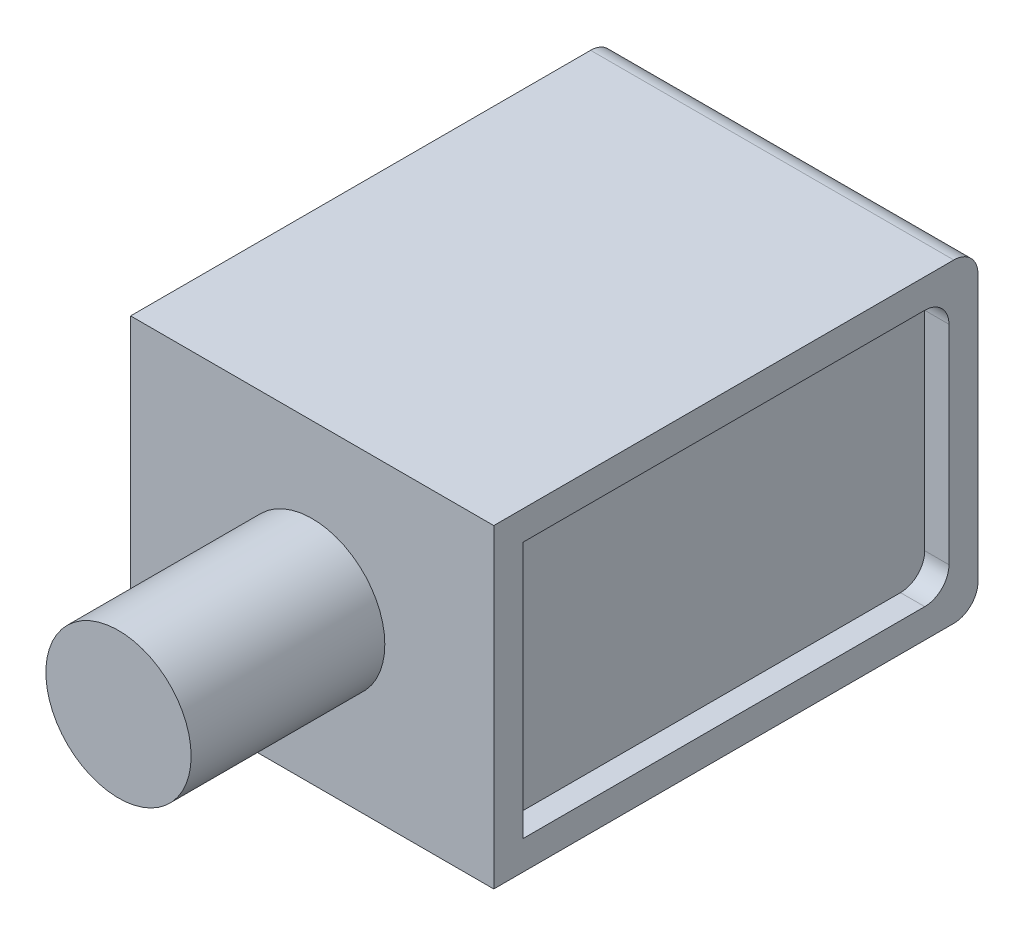
ISO-10303-21;
HEADER;
FILE_DESCRIPTION(('STEP AP214'),'2;1');
FILE_NAME('part.step','',(''),(''),'','','');
FILE_SCHEMA(('AUTOMOTIVE_DESIGN { 1 0 10303 214 1 1 1 1 }'));
ENDSEC;
DATA;
#1=APPLICATION_CONTEXT('core data for automotive mechanical design processes');
#2=APPLICATION_PROTOCOL_DEFINITION('international standard','automotive_design',2000,#1);
#3=PRODUCT_CONTEXT('',#1,'mechanical');
#4=PRODUCT('Part','Part','',(#3));
#5=PRODUCT_RELATED_PRODUCT_CATEGORY('part','',(#4));
#6=PRODUCT_DEFINITION_FORMATION('','',#4);
#7=PRODUCT_DEFINITION_CONTEXT('part definition',#1,'design');
#8=PRODUCT_DEFINITION('design','',#6,#7);
#9=PRODUCT_DEFINITION_SHAPE('','',#8);
#10=(LENGTH_UNIT() NAMED_UNIT(*) SI_UNIT(.MILLI.,.METRE.));
#11=(NAMED_UNIT(*) PLANE_ANGLE_UNIT() SI_UNIT($,.RADIAN.));
#12=(NAMED_UNIT(*) SI_UNIT($,.STERADIAN.) SOLID_ANGLE_UNIT());
#13=UNCERTAINTY_MEASURE_WITH_UNIT(LENGTH_MEASURE(1.E-05),#10,'distance_accuracy_value','');
#14=(GEOMETRIC_REPRESENTATION_CONTEXT(3) GLOBAL_UNCERTAINTY_ASSIGNED_CONTEXT((#13)) GLOBAL_UNIT_ASSIGNED_CONTEXT((#10,
#11,#12)) REPRESENTATION_CONTEXT('',''));
#15=CARTESIAN_POINT('',(0.,0.,0.));
#16=DIRECTION('',(0.,0.,1.));
#17=DIRECTION('',(1.,0.,0.));
#18=AXIS2_PLACEMENT_3D('',#15,#16,#17);
#19=CARTESIAN_POINT('',(-7.5,-6.5,10.));
#20=DIRECTION('',(1.,0.,0.));
#21=DIRECTION('',(0.,1.,0.));
#22=AXIS2_PLACEMENT_3D('',#19,#20,#21);
#23=PLANE('',#22);
#24=DIRECTION('',(0.,-1.,0.));
#25=VECTOR('',#24,1.);
#26=CARTESIAN_POINT('',(-7.5,-6.5,-10.));
#27=LINE('',#26,#25);
#28=CARTESIAN_POINT('',(-7.5,5.5,-10.));
#29=VERTEX_POINT('',#28);
#30=CARTESIAN_POINT('',(-7.5,-5.5,-10.));
#31=VERTEX_POINT('',#30);
#32=EDGE_CURVE('E230',#29,#31,#27,.T.);
#33=ORIENTED_EDGE('',*,*,#32,.T.);
#34=CARTESIAN_POINT('',(-7.5,-5.5,-9.));
#35=DIRECTION('',(1.,0.,0.));
#36=DIRECTION('',(0.,1.,0.));
#37=AXIS2_PLACEMENT_3D('',#34,#35,#36);
#38=CIRCLE('',#37,1.);
#39=CARTESIAN_POINT('',(-7.5,-6.5,-9.));
#40=VERTEX_POINT('',#39);
#41=EDGE_CURVE('E272',#31,#40,#38,.F.);
#42=ORIENTED_EDGE('',*,*,#41,.T.);
#43=DIRECTION('',(0.,0.,-1.));
#44=VECTOR('',#43,1.);
#45=CARTESIAN_POINT('',(-7.5,-6.5,10.));
#46=LINE('',#45,#44);
#47=CARTESIAN_POINT('',(-7.5,-6.5,10.));
#48=VERTEX_POINT('',#47);
#49=EDGE_CURVE('E256',#48,#40,#46,.T.);
#50=ORIENTED_EDGE('',*,*,#49,.F.);
#51=DIRECTION('',(0.,-1.,0.));
#52=VECTOR('',#51,1.);
#53=CARTESIAN_POINT('',(-7.5,-6.5,10.));
#54=LINE('',#53,#52);
#55=CARTESIAN_POINT('',(-7.5,6.5,10.));
#56=VERTEX_POINT('',#55);
#57=EDGE_CURVE('E233',#56,#48,#54,.T.);
#58=ORIENTED_EDGE('',*,*,#57,.F.);
#59=DIRECTION('',(0.,0.,-1.));
#60=VECTOR('',#59,1.);
#61=CARTESIAN_POINT('',(-7.5,6.5,10.));
#62=LINE('',#61,#60);
#63=CARTESIAN_POINT('',(-7.5,6.5,-9.));
#64=VERTEX_POINT('',#63);
#65=EDGE_CURVE('E243',#56,#64,#62,.T.);
#66=ORIENTED_EDGE('',*,*,#65,.T.);
#67=CARTESIAN_POINT('',(-7.5,5.5,-9.));
#68=DIRECTION('',(1.,0.,0.));
#69=DIRECTION('',(0.,1.,0.));
#70=AXIS2_PLACEMENT_3D('',#67,#68,#69);
#71=CIRCLE('',#70,1.);
#72=EDGE_CURVE('E270',#64,#29,#71,.F.);
#73=ORIENTED_EDGE('',*,*,#72,.T.);
#74=EDGE_LOOP('',(#33,#42,#50,#58,#66,#73));
#75=FACE_BOUND('',#74,.T.);
#76=DIRECTION('',(0.,0.,-1.));
#77=VECTOR('',#76,1.);
#78=CARTESIAN_POINT('',(-7.5,-5.3,8.8));
#79=LINE('',#78,#77);
#80=CARTESIAN_POINT('',(-7.5,-5.3,8.8));
#81=VERTEX_POINT('',#80);
#82=CARTESIAN_POINT('',(-7.5,-5.3,-7.8));
#83=VERTEX_POINT('',#82);
#84=EDGE_CURVE('E183',#81,#83,#79,.T.);
#85=ORIENTED_EDGE('',*,*,#84,.T.);
#86=CARTESIAN_POINT('',(-7.5,-4.3,-7.8));
#87=DIRECTION('',(1.,0.,0.));
#88=DIRECTION('',(0.,1.,0.));
#89=AXIS2_PLACEMENT_3D('',#86,#87,#88);
#90=CIRCLE('',#89,1.);
#91=CARTESIAN_POINT('',(-7.5,-4.3,-8.8));
#92=VERTEX_POINT('',#91);
#93=EDGE_CURVE('E305',#83,#92,#90,.T.);
#94=ORIENTED_EDGE('',*,*,#93,.T.);
#95=DIRECTION('',(0.,1.,0.));
#96=VECTOR('',#95,1.);
#97=CARTESIAN_POINT('',(-7.5,-5.3,-8.8));
#98=LINE('',#97,#96);
#99=CARTESIAN_POINT('',(-7.5,4.3,-8.8));
#100=VERTEX_POINT('',#99);
#101=EDGE_CURVE('E197',#92,#100,#98,.T.);
#102=ORIENTED_EDGE('',*,*,#101,.T.);
#103=CARTESIAN_POINT('',(-7.5,4.3,-7.8));
#104=DIRECTION('',(1.,0.,0.));
#105=DIRECTION('',(0.,1.,0.));
#106=AXIS2_PLACEMENT_3D('',#103,#104,#105);
#107=CIRCLE('',#106,1.);
#108=CARTESIAN_POINT('',(-7.5,5.3,-7.8));
#109=VERTEX_POINT('',#108);
#110=EDGE_CURVE('E43',#100,#109,#107,.T.);
#111=ORIENTED_EDGE('',*,*,#110,.T.);
#112=DIRECTION('',(0.,0.,1.));
#113=VECTOR('',#112,1.);
#114=CARTESIAN_POINT('',(-7.5,5.3,-8.8));
#115=LINE('',#114,#113);
#116=CARTESIAN_POINT('',(-7.5,5.3,8.8));
#117=VERTEX_POINT('',#116);
#118=EDGE_CURVE('E193',#109,#117,#115,.T.);
#119=ORIENTED_EDGE('',*,*,#118,.T.);
#120=DIRECTION('',(0.,-1.,0.));
#121=VECTOR('',#120,1.);
#122=CARTESIAN_POINT('',(-7.5,5.3,8.8));
#123=LINE('',#122,#121);
#124=EDGE_CURVE('E201',#117,#81,#123,.T.);
#125=ORIENTED_EDGE('',*,*,#124,.T.);
#126=EDGE_LOOP('',(#85,#94,#102,#111,#119,#125));
#127=FACE_BOUND('',#126,.T.);
#128=ADVANCED_FACE('F39',(#75,#127),#23,.F.);
#129=CARTESIAN_POINT('',(7.5,-6.5,10.));
#130=DIRECTION('',(0.,1.,0.));
#131=DIRECTION('',(-1.,0.,0.));
#132=AXIS2_PLACEMENT_3D('',#129,#130,#131);
#133=PLANE('',#132);
#134=ORIENTED_EDGE('',*,*,#49,.T.);
#135=DIRECTION('',(1.,0.,0.));
#136=VECTOR('',#135,1.);
#137=CARTESIAN_POINT('',(7.5,-6.5,-9.));
#138=LINE('',#137,#136);
#139=CARTESIAN_POINT('',(7.5,-6.5,-9.));
#140=VERTEX_POINT('',#139);
#141=EDGE_CURVE('E259',#40,#140,#138,.T.);
#142=ORIENTED_EDGE('',*,*,#141,.T.);
#143=DIRECTION('',(0.,0.,-1.));
#144=VECTOR('',#143,1.);
#145=CARTESIAN_POINT('',(7.5,-6.5,10.));
#146=LINE('',#145,#144);
#147=CARTESIAN_POINT('',(7.5,-6.5,10.));
#148=VERTEX_POINT('',#147);
#149=EDGE_CURVE('E253',#148,#140,#146,.T.);
#150=ORIENTED_EDGE('',*,*,#149,.F.);
#151=DIRECTION('',(1.,0.,0.));
#152=VECTOR('',#151,1.);
#153=CARTESIAN_POINT('',(7.5,-6.5,10.));
#154=LINE('',#153,#152);
#155=EDGE_CURVE('E236',#48,#148,#154,.T.);
#156=ORIENTED_EDGE('',*,*,#155,.F.);
#157=EDGE_LOOP('',(#134,#142,#150,#156));
#158=FACE_BOUND('',#157,.T.);
#159=ADVANCED_FACE('F323',(#158),#133,.F.);
#160=CARTESIAN_POINT('',(7.5,-6.5,10.));
#161=DIRECTION('',(-1.,0.,0.));
#162=DIRECTION('',(0.,0.,1.));
#163=AXIS2_PLACEMENT_3D('',#160,#161,#162);
#164=PLANE('',#163);
#165=DIRECTION('',(0.,0.,1.));
#166=VECTOR('',#165,1.);
#167=CARTESIAN_POINT('',(7.5,5.3,-8.8));
#168=LINE('',#167,#166);
#169=CARTESIAN_POINT('',(7.5,5.3,-7.8));
#170=VERTEX_POINT('',#169);
#171=CARTESIAN_POINT('',(7.5,5.3,8.8));
#172=VERTEX_POINT('',#171);
#173=EDGE_CURVE('E221',#170,#172,#168,.T.);
#174=ORIENTED_EDGE('',*,*,#173,.F.);
#175=CARTESIAN_POINT('',(7.5,4.3,-7.8));
#176=DIRECTION('',(-1.,0.,0.));
#177=DIRECTION('',(0.,0.,1.));
#178=AXIS2_PLACEMENT_3D('',#175,#176,#177);
#179=CIRCLE('',#178,1.);
#180=CARTESIAN_POINT('',(7.5,4.3,-8.8));
#181=VERTEX_POINT('',#180);
#182=EDGE_CURVE('E293',#170,#181,#179,.T.);
#183=ORIENTED_EDGE('',*,*,#182,.T.);
#184=DIRECTION('',(0.,1.,0.));
#185=VECTOR('',#184,1.);
#186=CARTESIAN_POINT('',(7.5,-5.3,-8.8));
#187=LINE('',#186,#185);
#188=CARTESIAN_POINT('',(7.5,-4.3,-8.8));
#189=VERTEX_POINT('',#188);
#190=EDGE_CURVE('E204',#189,#181,#187,.T.);
#191=ORIENTED_EDGE('',*,*,#190,.F.);
#192=CARTESIAN_POINT('',(7.5,-4.3,-7.8));
#193=DIRECTION('',(-1.,0.,0.));
#194=DIRECTION('',(0.,0.,1.));
#195=AXIS2_PLACEMENT_3D('',#192,#193,#194);
#196=CIRCLE('',#195,1.);
#197=CARTESIAN_POINT('',(7.5,-5.3,-7.8));
#198=VERTEX_POINT('',#197);
#199=EDGE_CURVE('E291',#189,#198,#196,.T.);
#200=ORIENTED_EDGE('',*,*,#199,.T.);
#201=DIRECTION('',(0.,0.,-1.));
#202=VECTOR('',#201,1.);
#203=CARTESIAN_POINT('',(7.5,-5.3,8.8));
#204=LINE('',#203,#202);
#205=CARTESIAN_POINT('',(7.5,-5.3,8.8));
#206=VERTEX_POINT('',#205);
#207=EDGE_CURVE('E210',#206,#198,#204,.T.);
#208=ORIENTED_EDGE('',*,*,#207,.F.);
#209=DIRECTION('',(0.,-1.,0.));
#210=VECTOR('',#209,1.);
#211=CARTESIAN_POINT('',(7.5,5.3,8.8));
#212=LINE('',#211,#210);
#213=EDGE_CURVE('E223',#172,#206,#212,.T.);
#214=ORIENTED_EDGE('',*,*,#213,.F.);
#215=EDGE_LOOP('',(#174,#183,#191,#200,#208,#214));
#216=FACE_BOUND('',#215,.T.);
#217=ORIENTED_EDGE('',*,*,#149,.T.);
#218=CARTESIAN_POINT('',(7.5,-5.5,-9.));
#219=DIRECTION('',(-1.,0.,0.));
#220=DIRECTION('',(0.,0.,1.));
#221=AXIS2_PLACEMENT_3D('',#218,#219,#220);
#222=CIRCLE('',#221,1.);
#223=CARTESIAN_POINT('',(7.5,-5.5,-10.));
#224=VERTEX_POINT('',#223);
#225=EDGE_CURVE('E264',#140,#224,#222,.F.);
#226=ORIENTED_EDGE('',*,*,#225,.T.);
#227=DIRECTION('',(0.,1.,0.));
#228=VECTOR('',#227,1.);
#229=CARTESIAN_POINT('',(7.5,-6.5,-10.));
#230=LINE('',#229,#228);
#231=CARTESIAN_POINT('',(7.5,5.5,-10.));
#232=VERTEX_POINT('',#231);
#233=EDGE_CURVE('E237',#224,#232,#230,.T.);
#234=ORIENTED_EDGE('',*,*,#233,.T.);
#235=CARTESIAN_POINT('',(7.5,5.5,-9.));
#236=DIRECTION('',(-1.,0.,0.));
#237=DIRECTION('',(0.,0.,1.));
#238=AXIS2_PLACEMENT_3D('',#235,#236,#237);
#239=CIRCLE('',#238,1.);
#240=CARTESIAN_POINT('',(7.5,6.5,-9.));
#241=VERTEX_POINT('',#240);
#242=EDGE_CURVE('E262',#232,#241,#239,.F.);
#243=ORIENTED_EDGE('',*,*,#242,.T.);
#244=DIRECTION('',(0.,0.,-1.));
#245=VECTOR('',#244,1.);
#246=CARTESIAN_POINT('',(7.5,6.5,10.));
#247=LINE('',#246,#245);
#248=CARTESIAN_POINT('',(7.5,6.5,10.));
#249=VERTEX_POINT('',#248);
#250=EDGE_CURVE('E250',#249,#241,#247,.T.);
#251=ORIENTED_EDGE('',*,*,#250,.F.);
#252=DIRECTION('',(0.,1.,0.));
#253=VECTOR('',#252,1.);
#254=CARTESIAN_POINT('',(7.5,-6.5,10.));
#255=LINE('',#254,#253);
#256=EDGE_CURVE('E239',#148,#249,#255,.T.);
#257=ORIENTED_EDGE('',*,*,#256,.F.);
#258=EDGE_LOOP('',(#217,#226,#234,#243,#251,#257));
#259=FACE_BOUND('',#258,.T.);
#260=ADVANCED_FACE('F329',(#216,#259),#164,.F.);
#261=CARTESIAN_POINT('',(7.5,6.5,10.));
#262=DIRECTION('',(0.,-1.,0.));
#263=DIRECTION('',(1.,0.,0.));
#264=AXIS2_PLACEMENT_3D('',#261,#262,#263);
#265=PLANE('',#264);
#266=ORIENTED_EDGE('',*,*,#250,.T.);
#267=DIRECTION('',(-1.,0.,0.));
#268=VECTOR('',#267,1.);
#269=CARTESIAN_POINT('',(7.5,6.5,-9.));
#270=LINE('',#269,#268);
#271=EDGE_CURVE('E274',#241,#64,#270,.T.);
#272=ORIENTED_EDGE('',*,*,#271,.T.);
#273=ORIENTED_EDGE('',*,*,#65,.F.);
#274=DIRECTION('',(-1.,0.,0.));
#275=VECTOR('',#274,1.);
#276=CARTESIAN_POINT('',(7.5,6.5,10.));
#277=LINE('',#276,#275);
#278=EDGE_CURVE('E241',#249,#56,#277,.T.);
#279=ORIENTED_EDGE('',*,*,#278,.F.);
#280=EDGE_LOOP('',(#266,#272,#273,#279));
#281=FACE_BOUND('',#280,.T.);
#282=ADVANCED_FACE('F382',(#281),#265,.F.);
#283=CARTESIAN_POINT('',(0.,0.,10.));
#284=DIRECTION('',(0.,0.,1.));
#285=DIRECTION('',(1.,0.,0.));
#286=AXIS2_PLACEMENT_3D('',#283,#284,#285);
#287=PLANE('',#286);
#288=CARTESIAN_POINT('',(0.,0.,10.));
#289=DIRECTION('',(0.,0.,1.));
#290=DIRECTION('',(1.,0.,0.));
#291=AXIS2_PLACEMENT_3D('',#288,#289,#290);
#292=CIRCLE('',#291,3.);
#293=CARTESIAN_POINT('',(3.,0.,10.));
#294=VERTEX_POINT('',#293);
#295=EDGE_CURVE('E11',#294,#294,#292,.T.);
#296=ORIENTED_EDGE('',*,*,#295,.F.);
#297=EDGE_LOOP('',(#296));
#298=FACE_BOUND('',#297,.T.);
#299=ORIENTED_EDGE('',*,*,#57,.T.);
#300=ORIENTED_EDGE('',*,*,#155,.T.);
#301=ORIENTED_EDGE('',*,*,#256,.T.);
#302=ORIENTED_EDGE('',*,*,#278,.T.);
#303=EDGE_LOOP('',(#299,#300,#301,#302));
#304=FACE_BOUND('',#303,.T.);
#305=ADVANCED_FACE('F401',(#298,#304),#287,.T.);
#306=CARTESIAN_POINT('',(0.,0.,-10.));
#307=DIRECTION('',(0.,0.,1.));
#308=DIRECTION('',(1.,0.,0.));
#309=AXIS2_PLACEMENT_3D('',#306,#307,#308);
#310=PLANE('',#309);
#311=ORIENTED_EDGE('',*,*,#233,.F.);
#312=DIRECTION('',(1.,0.,0.));
#313=VECTOR('',#312,1.);
#314=CARTESIAN_POINT('',(0.,-5.5,-10.));
#315=LINE('',#314,#313);
#316=EDGE_CURVE('E268',#224,#31,#315,.F.);
#317=ORIENTED_EDGE('',*,*,#316,.T.);
#318=ORIENTED_EDGE('',*,*,#32,.F.);
#319=DIRECTION('',(-1.,0.,0.));
#320=VECTOR('',#319,1.);
#321=CARTESIAN_POINT('',(0.,5.5,-10.));
#322=LINE('',#321,#320);
#323=EDGE_CURVE('E266',#29,#232,#322,.F.);
#324=ORIENTED_EDGE('',*,*,#323,.T.);
#325=EDGE_LOOP('',(#311,#317,#318,#324));
#326=FACE_BOUND('',#325,.T.);
#327=ADVANCED_FACE('F338',(#326),#310,.F.);
#328=CARTESIAN_POINT('',(7.5,-5.5,-9.));
#329=DIRECTION('',(1.,0.,0.));
#330=DIRECTION('',(0.,1.,0.));
#331=AXIS2_PLACEMENT_3D('',#328,#329,#330);
#332=CYLINDRICAL_SURFACE('',#331,1.);
#333=ORIENTED_EDGE('',*,*,#41,.F.);
#334=ORIENTED_EDGE('',*,*,#316,.F.);
#335=ORIENTED_EDGE('',*,*,#225,.F.);
#336=ORIENTED_EDGE('',*,*,#141,.F.);
#337=EDGE_LOOP('',(#333,#334,#335,#336));
#338=FACE_BOUND('',#337,.T.);
#339=ADVANCED_FACE('F334',(#338),#332,.T.);
#340=CARTESIAN_POINT('',(7.5,5.5,-9.));
#341=DIRECTION('',(-1.,0.,0.));
#342=DIRECTION('',(0.,-1.,0.));
#343=AXIS2_PLACEMENT_3D('',#340,#341,#342);
#344=CYLINDRICAL_SURFACE('',#343,1.);
#345=ORIENTED_EDGE('',*,*,#242,.F.);
#346=ORIENTED_EDGE('',*,*,#323,.F.);
#347=ORIENTED_EDGE('',*,*,#72,.F.);
#348=ORIENTED_EDGE('',*,*,#271,.F.);
#349=EDGE_LOOP('',(#345,#346,#347,#348));
#350=FACE_BOUND('',#349,.T.);
#351=ADVANCED_FACE('F337',(#350),#344,.T.);
#352=CARTESIAN_POINT('',(6.5,-5.3,-8.8));
#353=DIRECTION('',(0.,0.,-1.));
#354=DIRECTION('',(-1.,0.,0.));
#355=AXIS2_PLACEMENT_3D('',#352,#353,#354);
#356=PLANE('',#355);
#357=DIRECTION('',(0.,1.,0.));
#358=VECTOR('',#357,1.);
#359=CARTESIAN_POINT('',(6.5,-5.3,-8.8));
#360=LINE('',#359,#358);
#361=CARTESIAN_POINT('',(6.5,-4.3,-8.8));
#362=VERTEX_POINT('',#361);
#363=CARTESIAN_POINT('',(6.5,4.3,-8.8));
#364=VERTEX_POINT('',#363);
#365=EDGE_CURVE('E206',#362,#364,#360,.T.);
#366=ORIENTED_EDGE('',*,*,#365,.F.);
#367=DIRECTION('',(1.,0.,0.));
#368=VECTOR('',#367,1.);
#369=CARTESIAN_POINT('',(7.5,-4.3,-8.8));
#370=LINE('',#369,#368);
#371=EDGE_CURVE('E279',#362,#189,#370,.T.);
#372=ORIENTED_EDGE('',*,*,#371,.T.);
#373=ORIENTED_EDGE('',*,*,#190,.T.);
#374=DIRECTION('',(1.,0.,0.));
#375=VECTOR('',#374,1.);
#376=CARTESIAN_POINT('',(6.5,4.3,-8.8));
#377=LINE('',#376,#375);
#378=EDGE_CURVE('E277',#181,#364,#377,.F.);
#379=ORIENTED_EDGE('',*,*,#378,.T.);
#380=EDGE_LOOP('',(#366,#372,#373,#379));
#381=FACE_BOUND('',#380,.T.);
#382=ADVANCED_FACE('F342',(#381),#356,.F.);
#383=CARTESIAN_POINT('',(6.5,-5.3,8.8));
#384=DIRECTION('',(0.,-1.,0.));
#385=DIRECTION('',(0.,0.,-1.));
#386=AXIS2_PLACEMENT_3D('',#383,#384,#385);
#387=PLANE('',#386);
#388=ORIENTED_EDGE('',*,*,#207,.T.);
#389=DIRECTION('',(1.,0.,0.));
#390=VECTOR('',#389,1.);
#391=CARTESIAN_POINT('',(6.5,-5.3,-7.8));
#392=LINE('',#391,#390);
#393=CARTESIAN_POINT('',(6.5,-5.3,-7.8));
#394=VERTEX_POINT('',#393);
#395=EDGE_CURVE('E282',#198,#394,#392,.F.);
#396=ORIENTED_EDGE('',*,*,#395,.T.);
#397=DIRECTION('',(0.,0.,-1.));
#398=VECTOR('',#397,1.);
#399=CARTESIAN_POINT('',(6.5,-5.3,8.8));
#400=LINE('',#399,#398);
#401=CARTESIAN_POINT('',(6.5,-5.3,8.8));
#402=VERTEX_POINT('',#401);
#403=EDGE_CURVE('E215',#402,#394,#400,.T.);
#404=ORIENTED_EDGE('',*,*,#403,.F.);
#405=DIRECTION('',(1.,0.,0.));
#406=VECTOR('',#405,1.);
#407=CARTESIAN_POINT('',(6.5,-5.3,8.8));
#408=LINE('',#407,#406);
#409=EDGE_CURVE('E228',#402,#206,#408,.T.);
#410=ORIENTED_EDGE('',*,*,#409,.T.);
#411=EDGE_LOOP('',(#388,#396,#404,#410));
#412=FACE_BOUND('',#411,.T.);
#413=ADVANCED_FACE('F373',(#412),#387,.F.);
#414=CARTESIAN_POINT('',(6.5,5.3,8.8));
#415=DIRECTION('',(0.,0.,1.));
#416=DIRECTION('',(1.,0.,0.));
#417=AXIS2_PLACEMENT_3D('',#414,#415,#416);
#418=PLANE('',#417);
#419=ORIENTED_EDGE('',*,*,#213,.T.);
#420=ORIENTED_EDGE('',*,*,#409,.F.);
#421=DIRECTION('',(0.,-1.,0.));
#422=VECTOR('',#421,1.);
#423=CARTESIAN_POINT('',(6.5,5.3,8.8));
#424=LINE('',#423,#422);
#425=CARTESIAN_POINT('',(6.5,5.3,8.8));
#426=VERTEX_POINT('',#425);
#427=EDGE_CURVE('E212',#426,#402,#424,.T.);
#428=ORIENTED_EDGE('',*,*,#427,.F.);
#429=DIRECTION('',(1.,0.,0.));
#430=VECTOR('',#429,1.);
#431=CARTESIAN_POINT('',(6.5,5.3,8.8));
#432=LINE('',#431,#430);
#433=EDGE_CURVE('E218',#426,#172,#432,.T.);
#434=ORIENTED_EDGE('',*,*,#433,.T.);
#435=EDGE_LOOP('',(#419,#420,#428,#434));
#436=FACE_BOUND('',#435,.T.);
#437=ADVANCED_FACE('F369',(#436),#418,.F.);
#438=CARTESIAN_POINT('',(6.5,5.3,-8.8));
#439=DIRECTION('',(0.,1.,0.));
#440=DIRECTION('',(0.,0.,1.));
#441=AXIS2_PLACEMENT_3D('',#438,#439,#440);
#442=PLANE('',#441);
#443=DIRECTION('',(0.,0.,1.));
#444=VECTOR('',#443,1.);
#445=CARTESIAN_POINT('',(6.5,5.3,-8.8));
#446=LINE('',#445,#444);
#447=CARTESIAN_POINT('',(6.5,5.3,-7.8));
#448=VERTEX_POINT('',#447);
#449=EDGE_CURVE('E209',#448,#426,#446,.T.);
#450=ORIENTED_EDGE('',*,*,#449,.F.);
#451=DIRECTION('',(1.,0.,0.));
#452=VECTOR('',#451,1.);
#453=CARTESIAN_POINT('',(7.5,5.3,-7.8));
#454=LINE('',#453,#452);
#455=EDGE_CURVE('E288',#448,#170,#454,.T.);
#456=ORIENTED_EDGE('',*,*,#455,.T.);
#457=ORIENTED_EDGE('',*,*,#173,.T.);
#458=ORIENTED_EDGE('',*,*,#433,.F.);
#459=EDGE_LOOP('',(#450,#456,#457,#458));
#460=FACE_BOUND('',#459,.T.);
#461=ADVANCED_FACE('F364',(#460),#442,.F.);
#462=CARTESIAN_POINT('',(6.5,0.,0.));
#463=DIRECTION('',(1.,0.,0.));
#464=DIRECTION('',(0.,0.,-1.));
#465=AXIS2_PLACEMENT_3D('',#462,#463,#464);
#466=PLANE('',#465);
#467=ORIENTED_EDGE('',*,*,#403,.T.);
#468=CARTESIAN_POINT('',(6.5,-4.3,-7.8));
#469=DIRECTION('',(1.,0.,0.));
#470=DIRECTION('',(0.,0.,-1.));
#471=AXIS2_PLACEMENT_3D('',#468,#469,#470);
#472=CIRCLE('',#471,1.);
#473=EDGE_CURVE('E286',#394,#362,#472,.T.);
#474=ORIENTED_EDGE('',*,*,#473,.T.);
#475=ORIENTED_EDGE('',*,*,#365,.T.);
#476=CARTESIAN_POINT('',(6.5,4.3,-7.8));
#477=DIRECTION('',(1.,0.,0.));
#478=DIRECTION('',(0.,0.,-1.));
#479=AXIS2_PLACEMENT_3D('',#476,#477,#478);
#480=CIRCLE('',#479,1.);
#481=EDGE_CURVE('E284',#364,#448,#480,.T.);
#482=ORIENTED_EDGE('',*,*,#481,.T.);
#483=ORIENTED_EDGE('',*,*,#449,.T.);
#484=ORIENTED_EDGE('',*,*,#427,.T.);
#485=EDGE_LOOP('',(#467,#474,#475,#482,#483,#484));
#486=FACE_BOUND('',#485,.T.);
#487=ADVANCED_FACE('F347',(#486),#466,.T.);
#488=CARTESIAN_POINT('',(6.5,-4.3,-7.8));
#489=DIRECTION('',(-1.,0.,0.));
#490=DIRECTION('',(0.,0.,1.));
#491=AXIS2_PLACEMENT_3D('',#488,#489,#490);
#492=CYLINDRICAL_SURFACE('',#491,1.);
#493=ORIENTED_EDGE('',*,*,#473,.F.);
#494=ORIENTED_EDGE('',*,*,#395,.F.);
#495=ORIENTED_EDGE('',*,*,#199,.F.);
#496=ORIENTED_EDGE('',*,*,#371,.F.);
#497=EDGE_LOOP('',(#493,#494,#495,#496));
#498=FACE_BOUND('',#497,.T.);
#499=ADVANCED_FACE('F344',(#498),#492,.F.);
#500=CARTESIAN_POINT('',(6.5,4.3,-7.8));
#501=DIRECTION('',(-1.,0.,0.));
#502=DIRECTION('',(0.,0.,1.));
#503=AXIS2_PLACEMENT_3D('',#500,#501,#502);
#504=CYLINDRICAL_SURFACE('',#503,1.);
#505=ORIENTED_EDGE('',*,*,#481,.F.);
#506=ORIENTED_EDGE('',*,*,#378,.F.);
#507=ORIENTED_EDGE('',*,*,#182,.F.);
#508=ORIENTED_EDGE('',*,*,#455,.F.);
#509=EDGE_LOOP('',(#505,#506,#507,#508));
#510=FACE_BOUND('',#509,.T.);
#511=ADVANCED_FACE('F346',(#510),#504,.F.);
#512=CARTESIAN_POINT('',(-6.5,-5.3,-8.8));
#513=DIRECTION('',(0.,0.,1.));
#514=DIRECTION('',(1.,0.,0.));
#515=AXIS2_PLACEMENT_3D('',#512,#513,#514);
#516=PLANE('',#515);
#517=ORIENTED_EDGE('',*,*,#101,.F.);
#518=DIRECTION('',(-1.,0.,0.));
#519=VECTOR('',#518,1.);
#520=CARTESIAN_POINT('',(-6.5,-4.3,-8.8));
#521=LINE('',#520,#519);
#522=CARTESIAN_POINT('',(-6.5,-4.3,-8.8));
#523=VERTEX_POINT('',#522);
#524=EDGE_CURVE('E300',#92,#523,#521,.F.);
#525=ORIENTED_EDGE('',*,*,#524,.T.);
#526=DIRECTION('',(0.,1.,0.));
#527=VECTOR('',#526,1.);
#528=CARTESIAN_POINT('',(-6.5,-5.3,-8.8));
#529=LINE('',#528,#527);
#530=CARTESIAN_POINT('',(-6.5,4.3,-8.8));
#531=VERTEX_POINT('',#530);
#532=EDGE_CURVE('E190',#523,#531,#529,.T.);
#533=ORIENTED_EDGE('',*,*,#532,.T.);
#534=DIRECTION('',(-1.,0.,0.));
#535=VECTOR('',#534,1.);
#536=CARTESIAN_POINT('',(-7.5,4.3,-8.8));
#537=LINE('',#536,#535);
#538=EDGE_CURVE('E297',#531,#100,#537,.T.);
#539=ORIENTED_EDGE('',*,*,#538,.T.);
#540=EDGE_LOOP('',(#517,#525,#533,#539));
#541=FACE_BOUND('',#540,.T.);
#542=ADVANCED_FACE('F310',(#541),#516,.T.);
#543=CARTESIAN_POINT('',(-6.5,5.3,-8.8));
#544=DIRECTION('',(0.,-1.,0.));
#545=DIRECTION('',(0.,0.,-1.));
#546=AXIS2_PLACEMENT_3D('',#543,#544,#545);
#547=PLANE('',#546);
#548=ORIENTED_EDGE('',*,*,#118,.F.);
#549=DIRECTION('',(-1.,0.,0.));
#550=VECTOR('',#549,1.);
#551=CARTESIAN_POINT('',(-6.5,5.3,-7.8));
#552=LINE('',#551,#550);
#553=CARTESIAN_POINT('',(-6.5,5.3,-7.8));
#554=VERTEX_POINT('',#553);
#555=EDGE_CURVE('E61',#109,#554,#552,.F.);
#556=ORIENTED_EDGE('',*,*,#555,.T.);
#557=DIRECTION('',(0.,0.,1.));
#558=VECTOR('',#557,1.);
#559=CARTESIAN_POINT('',(-6.5,5.3,-8.8));
#560=LINE('',#559,#558);
#561=CARTESIAN_POINT('',(-6.5,5.3,8.8));
#562=VERTEX_POINT('',#561);
#563=EDGE_CURVE('E174',#554,#562,#560,.T.);
#564=ORIENTED_EDGE('',*,*,#563,.T.);
#565=DIRECTION('',(-1.,0.,0.));
#566=VECTOR('',#565,1.);
#567=CARTESIAN_POINT('',(-6.5,5.3,8.8));
#568=LINE('',#567,#566);
#569=EDGE_CURVE('E171',#562,#117,#568,.T.);
#570=ORIENTED_EDGE('',*,*,#569,.T.);
#571=EDGE_LOOP('',(#548,#556,#564,#570));
#572=FACE_BOUND('',#571,.T.);
#573=ADVANCED_FACE('F354',(#572),#547,.T.);
#574=CARTESIAN_POINT('',(-6.5,5.3,8.8));
#575=DIRECTION('',(0.,0.,-1.));
#576=DIRECTION('',(-1.,0.,0.));
#577=AXIS2_PLACEMENT_3D('',#574,#575,#576);
#578=PLANE('',#577);
#579=ORIENTED_EDGE('',*,*,#124,.F.);
#580=ORIENTED_EDGE('',*,*,#569,.F.);
#581=DIRECTION('',(0.,-1.,0.));
#582=VECTOR('',#581,1.);
#583=CARTESIAN_POINT('',(-6.5,5.3,8.8));
#584=LINE('',#583,#582);
#585=CARTESIAN_POINT('',(-6.5,-5.3,8.8));
#586=VERTEX_POINT('',#585);
#587=EDGE_CURVE('E164',#562,#586,#584,.T.);
#588=ORIENTED_EDGE('',*,*,#587,.T.);
#589=DIRECTION('',(-1.,0.,0.));
#590=VECTOR('',#589,1.);
#591=CARTESIAN_POINT('',(-6.5,-5.3,8.8));
#592=LINE('',#591,#590);
#593=EDGE_CURVE('E168',#586,#81,#592,.T.);
#594=ORIENTED_EDGE('',*,*,#593,.T.);
#595=EDGE_LOOP('',(#579,#580,#588,#594));
#596=FACE_BOUND('',#595,.T.);
#597=ADVANCED_FACE('F167',(#596),#578,.T.);
#598=CARTESIAN_POINT('',(-6.5,-5.3,8.8));
#599=DIRECTION('',(0.,1.,0.));
#600=DIRECTION('',(0.,0.,1.));
#601=AXIS2_PLACEMENT_3D('',#598,#599,#600);
#602=PLANE('',#601);
#603=DIRECTION('',(0.,0.,-1.));
#604=VECTOR('',#603,1.);
#605=CARTESIAN_POINT('',(-6.5,-5.3,8.8));
#606=LINE('',#605,#604);
#607=CARTESIAN_POINT('',(-6.5,-5.3,-7.8));
#608=VERTEX_POINT('',#607);
#609=EDGE_CURVE('E175',#586,#608,#606,.T.);
#610=ORIENTED_EDGE('',*,*,#609,.T.);
#611=DIRECTION('',(-1.,0.,0.));
#612=VECTOR('',#611,1.);
#613=CARTESIAN_POINT('',(-7.5,-5.3,-7.8));
#614=LINE('',#613,#612);
#615=EDGE_CURVE('E295',#608,#83,#614,.T.);
#616=ORIENTED_EDGE('',*,*,#615,.T.);
#617=ORIENTED_EDGE('',*,*,#84,.F.);
#618=ORIENTED_EDGE('',*,*,#593,.F.);
#619=EDGE_LOOP('',(#610,#616,#617,#618));
#620=FACE_BOUND('',#619,.T.);
#621=ADVANCED_FACE('F179',(#620),#602,.T.);
#622=CARTESIAN_POINT('',(-6.5,0.,0.));
#623=DIRECTION('',(-1.,0.,0.));
#624=DIRECTION('',(0.,0.,-1.));
#625=AXIS2_PLACEMENT_3D('',#622,#623,#624);
#626=PLANE('',#625);
#627=ORIENTED_EDGE('',*,*,#532,.F.);
#628=CARTESIAN_POINT('',(-6.5,-4.3,-7.8));
#629=DIRECTION('',(-1.,0.,0.));
#630=DIRECTION('',(0.,0.,1.));
#631=AXIS2_PLACEMENT_3D('',#628,#629,#630);
#632=CIRCLE('',#631,1.);
#633=EDGE_CURVE('E189',#523,#608,#632,.T.);
#634=ORIENTED_EDGE('',*,*,#633,.T.);
#635=ORIENTED_EDGE('',*,*,#609,.F.);
#636=ORIENTED_EDGE('',*,*,#587,.F.);
#637=ORIENTED_EDGE('',*,*,#563,.F.);
#638=CARTESIAN_POINT('',(-6.5,4.3,-7.8));
#639=DIRECTION('',(-1.,0.,0.));
#640=DIRECTION('',(0.,0.,1.));
#641=AXIS2_PLACEMENT_3D('',#638,#639,#640);
#642=CIRCLE('',#641,1.);
#643=EDGE_CURVE('E302',#554,#531,#642,.T.);
#644=ORIENTED_EDGE('',*,*,#643,.T.);
#645=EDGE_LOOP('',(#627,#634,#635,#636,#637,#644));
#646=FACE_BOUND('',#645,.T.);
#647=ADVANCED_FACE('F187',(#646),#626,.T.);
#648=CARTESIAN_POINT('',(-6.5,-4.3,-7.8));
#649=DIRECTION('',(1.,0.,0.));
#650=DIRECTION('',(0.,0.,-1.));
#651=AXIS2_PLACEMENT_3D('',#648,#649,#650);
#652=CYLINDRICAL_SURFACE('',#651,1.);
#653=ORIENTED_EDGE('',*,*,#633,.F.);
#654=ORIENTED_EDGE('',*,*,#524,.F.);
#655=ORIENTED_EDGE('',*,*,#93,.F.);
#656=ORIENTED_EDGE('',*,*,#615,.F.);
#657=EDGE_LOOP('',(#653,#654,#655,#656));
#658=FACE_BOUND('',#657,.T.);
#659=ADVANCED_FACE('F312',(#658),#652,.F.);
#660=CARTESIAN_POINT('',(-6.5,4.3,-7.8));
#661=DIRECTION('',(1.,0.,0.));
#662=DIRECTION('',(0.,0.,-1.));
#663=AXIS2_PLACEMENT_3D('',#660,#661,#662);
#664=CYLINDRICAL_SURFACE('',#663,1.);
#665=ORIENTED_EDGE('',*,*,#643,.F.);
#666=ORIENTED_EDGE('',*,*,#555,.F.);
#667=ORIENTED_EDGE('',*,*,#110,.F.);
#668=ORIENTED_EDGE('',*,*,#538,.F.);
#669=EDGE_LOOP('',(#665,#666,#667,#668));
#670=FACE_BOUND('',#669,.T.);
#671=ADVANCED_FACE('F41',(#670),#664,.F.);
#672=CARTESIAN_POINT('',(0.,0.,18.));
#673=DIRECTION('',(0.,0.,-1.));
#674=DIRECTION('',(-1.,0.,0.));
#675=AXIS2_PLACEMENT_3D('',#672,#673,#674);
#676=CYLINDRICAL_SURFACE('',#675,3.);
#677=CARTESIAN_POINT('',(0.,0.,18.));
#678=DIRECTION('',(0.,0.,1.));
#679=DIRECTION('',(1.,0.,0.));
#680=AXIS2_PLACEMENT_3D('',#677,#678,#679);
#681=CIRCLE('',#680,3.);
#682=CARTESIAN_POINT('',(3.,0.,18.));
#683=VERTEX_POINT('',#682);
#684=EDGE_CURVE('E199',#683,#683,#681,.T.);
#685=ORIENTED_EDGE('',*,*,#684,.F.);
#686=EDGE_LOOP('',(#685));
#687=FACE_BOUND('',#686,.T.);
#688=ORIENTED_EDGE('',*,*,#295,.T.);
#689=EDGE_LOOP('',(#688));
#690=FACE_BOUND('',#689,.T.);
#691=ADVANCED_FACE('F318',(#687,#690),#676,.T.);
#692=CARTESIAN_POINT('',(0.,0.,18.));
#693=DIRECTION('',(0.,0.,1.));
#694=DIRECTION('',(1.,0.,0.));
#695=AXIS2_PLACEMENT_3D('',#692,#693,#694);
#696=PLANE('',#695);
#697=ORIENTED_EDGE('',*,*,#684,.T.);
#698=EDGE_LOOP('',(#697));
#699=FACE_BOUND('',#698,.T.);
#700=ADVANCED_FACE('F431',(#699),#696,.T.);
#701=CLOSED_SHELL('',(#128,#159,#260,#282,#305,#327,#339,#351,#382,#413,#437,#461,#487,#499,
#511,#542,#573,#597,#621,#647,#659,#671,#691,#700));
#702=MANIFOLD_SOLID_BREP('B2',#701);
#703=ADVANCED_BREP_SHAPE_REPRESENTATION('',(#18,#702),#14);
#704=SHAPE_DEFINITION_REPRESENTATION(#9,#703);
ENDSEC;
END-ISO-10303-21;
